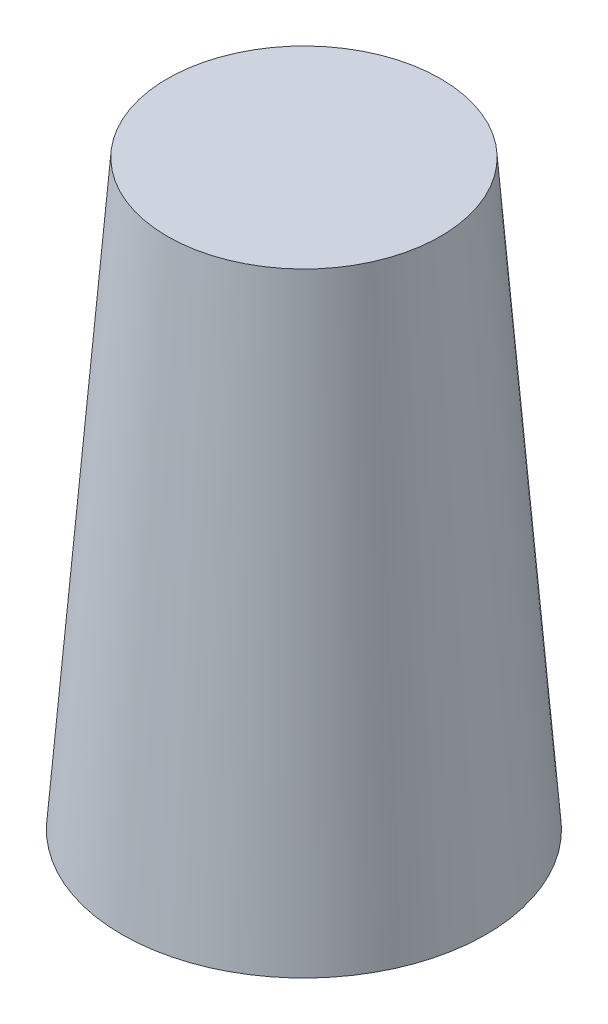
ISO-10303-21;
HEADER;
FILE_DESCRIPTION(('STEP AP214'),'2;1');
FILE_NAME('part.step','',(''),(''),'','','');
FILE_SCHEMA(('AUTOMOTIVE_DESIGN { 1 0 10303 214 1 1 1 1 }'));
ENDSEC;
DATA;
#1=APPLICATION_CONTEXT('core data for automotive mechanical design processes');
#2=APPLICATION_PROTOCOL_DEFINITION('international standard','automotive_design',2000,#1);
#3=PRODUCT_CONTEXT('',#1,'mechanical');
#4=PRODUCT('Part','Part','',(#3));
#5=PRODUCT_RELATED_PRODUCT_CATEGORY('part','',(#4));
#6=PRODUCT_DEFINITION_FORMATION('','',#4);
#7=PRODUCT_DEFINITION_CONTEXT('part definition',#1,'design');
#8=PRODUCT_DEFINITION('design','',#6,#7);
#9=PRODUCT_DEFINITION_SHAPE('','',#8);
#10=(LENGTH_UNIT() NAMED_UNIT(*) SI_UNIT(.MILLI.,.METRE.));
#11=(NAMED_UNIT(*) PLANE_ANGLE_UNIT() SI_UNIT($,.RADIAN.));
#12=(NAMED_UNIT(*) SI_UNIT($,.STERADIAN.) SOLID_ANGLE_UNIT());
#13=UNCERTAINTY_MEASURE_WITH_UNIT(LENGTH_MEASURE(1.E-05),#10,'distance_accuracy_value','');
#14=(GEOMETRIC_REPRESENTATION_CONTEXT(3) GLOBAL_UNCERTAINTY_ASSIGNED_CONTEXT((#13)) GLOBAL_UNIT_ASSIGNED_CONTEXT((#10,
#11,#12)) REPRESENTATION_CONTEXT('',''));
#15=CARTESIAN_POINT('',(0.,0.,0.));
#16=DIRECTION('',(0.,0.,1.));
#17=DIRECTION('',(1.,0.,0.));
#18=AXIS2_PLACEMENT_3D('',#15,#16,#17);
#19=CARTESIAN_POINT('',(0.,113.5,0.));
#20=DIRECTION('',(0.,1.,0.));
#21=DIRECTION('',(0.,0.,1.));
#22=AXIS2_PLACEMENT_3D('',#19,#20,#21);
#23=PLANE('',#22);
#24=CARTESIAN_POINT('',(0.,113.5,0.));
#25=DIRECTION('',(0.,1.,0.));
#26=DIRECTION('',(0.,0.,1.));
#27=AXIS2_PLACEMENT_3D('',#24,#25,#26);
#28=CIRCLE('',#27,25.6128047437484);
#29=CARTESIAN_POINT('',(0.,113.5,25.6128047437484));
#30=VERTEX_POINT('',#29);
#31=EDGE_CURVE('E10',#30,#30,#28,.T.);
#32=ORIENTED_EDGE('',*,*,#31,.F.);
#33=EDGE_LOOP('',(#32));
#34=FACE_BOUND('',#33,.T.);
#35=ADVANCED_FACE('F34',(#34),#23,.F.);
#36=CARTESIAN_POINT('',(0.,113.5,0.));
#37=DIRECTION('',(0.,-1.,0.));
#38=DIRECTION('',(0.,0.,-1.));
#39=AXIS2_PLACEMENT_3D('',#36,#37,#38);
#40=CONICAL_SURFACE('',#39,25.6128047437484,0.0781016777199855);
#41=CARTESIAN_POINT('',(0.,0.,0.));
#42=DIRECTION('',(0.,1.,0.));
#43=DIRECTION('',(0.,0.,1.));
#44=AXIS2_PLACEMENT_3D('',#41,#42,#43);
#45=CIRCLE('',#44,34.4954134394006);
#46=CARTESIAN_POINT('',(0.,0.,34.4954134394006));
#47=VERTEX_POINT('',#46);
#48=EDGE_CURVE('E40',#47,#47,#45,.T.);
#49=ORIENTED_EDGE('',*,*,#48,.F.);
#50=EDGE_LOOP('',(#49));
#51=FACE_BOUND('',#50,.T.);
#52=ORIENTED_EDGE('',*,*,#31,.T.);
#53=EDGE_LOOP('',(#52));
#54=FACE_BOUND('',#53,.T.);
#55=ADVANCED_FACE('F64',(#51,#54),#40,.F.);
#56=CARTESIAN_POINT('',(36.,0.,0.));
#57=DIRECTION('',(0.,1.,0.));
#58=DIRECTION('',(0.,0.,1.));
#59=AXIS2_PLACEMENT_3D('',#56,#57,#58);
#60=PLANE('',#59);
#61=CARTESIAN_POINT('',(0.,0.,0.));
#62=DIRECTION('',(0.,1.,0.));
#63=DIRECTION('',(0.,0.,1.));
#64=AXIS2_PLACEMENT_3D('',#61,#62,#63);
#65=CIRCLE('',#64,36.);
#66=CARTESIAN_POINT('',(0.,0.,36.));
#67=VERTEX_POINT('',#66);
#68=EDGE_CURVE('E44',#67,#67,#65,.T.);
#69=ORIENTED_EDGE('',*,*,#68,.F.);
#70=EDGE_LOOP('',(#69));
#71=FACE_BOUND('',#70,.T.);
#72=ORIENTED_EDGE('',*,*,#48,.T.);
#73=EDGE_LOOP('',(#72));
#74=FACE_BOUND('',#73,.T.);
#75=ADVANCED_FACE('F59',(#71,#74),#60,.F.);
#76=CARTESIAN_POINT('',(0.,0.,0.));
#77=DIRECTION('',(0.,-1.,0.));
#78=DIRECTION('',(0.,0.,-1.));
#79=AXIS2_PLACEMENT_3D('',#76,#77,#78);
#80=CONICAL_SURFACE('',#79,36.,0.0781016777199855);
#81=CARTESIAN_POINT('',(0.,115.,0.));
#82=DIRECTION('',(0.,1.,0.));
#83=DIRECTION('',(0.,0.,1.));
#84=AXIS2_PLACEMENT_3D('',#81,#82,#83);
#85=CIRCLE('',#84,27.);
#86=CARTESIAN_POINT('',(0.,115.,27.));
#87=VERTEX_POINT('',#86);
#88=EDGE_CURVE('E48',#87,#87,#85,.T.);
#89=ORIENTED_EDGE('',*,*,#88,.F.);
#90=EDGE_LOOP('',(#89));
#91=FACE_BOUND('',#90,.T.);
#92=ORIENTED_EDGE('',*,*,#68,.T.);
#93=EDGE_LOOP('',(#92));
#94=FACE_BOUND('',#93,.T.);
#95=ADVANCED_FACE('F56',(#91,#94),#80,.T.);
#96=CARTESIAN_POINT('',(0.,115.,0.));
#97=DIRECTION('',(0.,-1.,0.));
#98=DIRECTION('',(0.,0.,-1.));
#99=AXIS2_PLACEMENT_3D('',#96,#97,#98);
#100=PLANE('',#99);
#101=ORIENTED_EDGE('',*,*,#88,.T.);
#102=EDGE_LOOP('',(#101));
#103=FACE_BOUND('',#102,.T.);
#104=ADVANCED_FACE('F54',(#103),#100,.F.);
#105=CLOSED_SHELL('',(#35,#55,#75,#95,#104));
#106=MANIFOLD_SOLID_BREP('B2',#105);
#107=ADVANCED_BREP_SHAPE_REPRESENTATION('',(#18,#106),#14);
#108=SHAPE_DEFINITION_REPRESENTATION(#9,#107);
ENDSEC;
END-ISO-10303-21;
